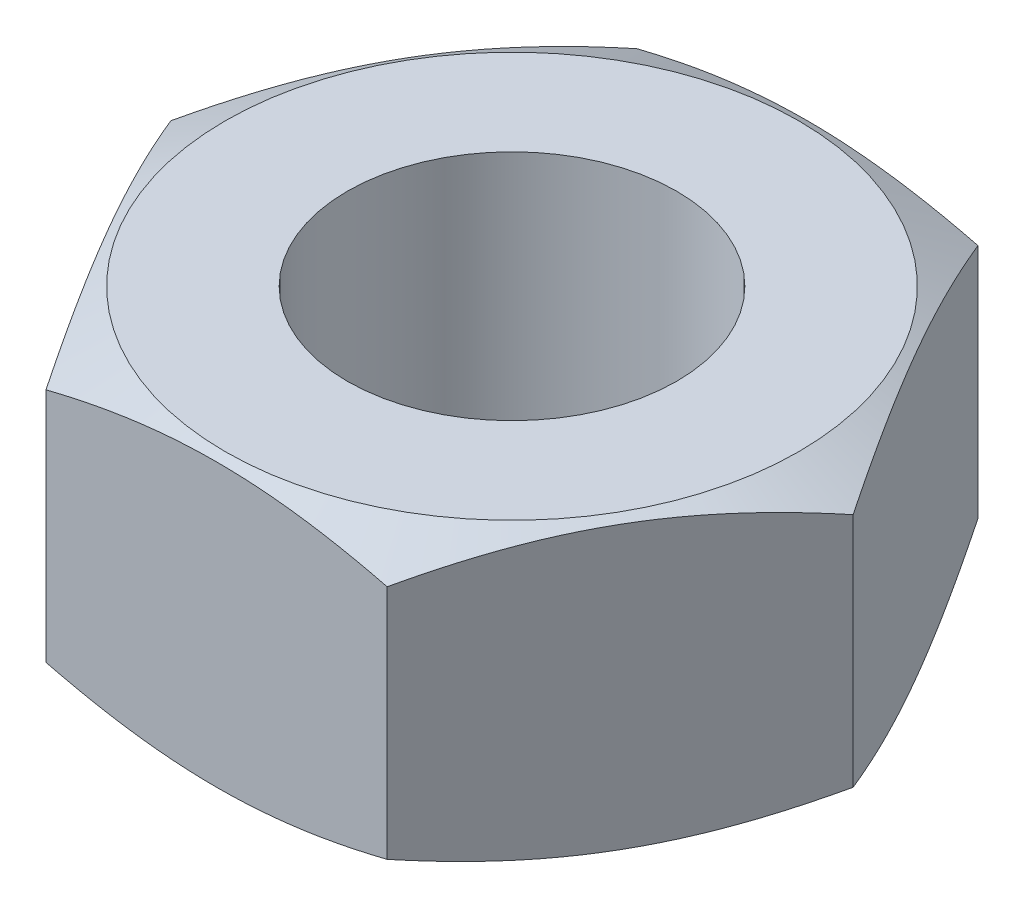
ISO-10303-21;
HEADER;
FILE_DESCRIPTION(('STEP AP214'),'2;1');
FILE_NAME('part.step','',(''),(''),'','','');
FILE_SCHEMA(('AUTOMOTIVE_DESIGN { 1 0 10303 214 1 1 1 1 }'));
ENDSEC;
DATA;
#1=APPLICATION_CONTEXT('core data for automotive mechanical design processes');
#2=APPLICATION_PROTOCOL_DEFINITION('international standard','automotive_design',2000,#1);
#3=PRODUCT_CONTEXT('',#1,'mechanical');
#4=PRODUCT('Part','Part','',(#3));
#5=PRODUCT_RELATED_PRODUCT_CATEGORY('part','',(#4));
#6=PRODUCT_DEFINITION_FORMATION('','',#4);
#7=PRODUCT_DEFINITION_CONTEXT('part definition',#1,'design');
#8=PRODUCT_DEFINITION('design','',#6,#7);
#9=PRODUCT_DEFINITION_SHAPE('','',#8);
#10=(LENGTH_UNIT() NAMED_UNIT(*) SI_UNIT(.MILLI.,.METRE.));
#11=(NAMED_UNIT(*) PLANE_ANGLE_UNIT() SI_UNIT($,.RADIAN.));
#12=(NAMED_UNIT(*) SI_UNIT($,.STERADIAN.) SOLID_ANGLE_UNIT());
#13=UNCERTAINTY_MEASURE_WITH_UNIT(LENGTH_MEASURE(1.E-05),#10,'distance_accuracy_value','');
#14=(GEOMETRIC_REPRESENTATION_CONTEXT(3) GLOBAL_UNCERTAINTY_ASSIGNED_CONTEXT((#13)) GLOBAL_UNIT_ASSIGNED_CONTEXT((#10,
#11,#12)) REPRESENTATION_CONTEXT('',''));
#15=CARTESIAN_POINT('',(0.,0.,0.));
#16=DIRECTION('',(0.,0.,1.));
#17=DIRECTION('',(1.,0.,0.));
#18=AXIS2_PLACEMENT_3D('',#15,#16,#17);
#19=CARTESIAN_POINT('',(-3.13091277478846,5.334,-5.42289999999993));
#20=DIRECTION('',(0.866025403784442,0.,0.499999999999995));
#21=DIRECTION('',(0.499999999999995,0.,-0.866025403784442));
#22=AXIS2_PLACEMENT_3D('',#19,#20,#21);
#23=PLANE('',#22);
#24=CARTESIAN_POINT('',(-6.26194101963064,0.500057736623868,0.000199999999999868));
#25=CARTESIAN_POINT('',(-6.17369545991849,0.455935781478425,-0.1526457929638));
#26=CARTESIAN_POINT('',(-6.08510610212949,0.414432168279962,-0.306087061664247));
#27=CARTESIAN_POINT('',(-5.90722176334585,0.337535609700191,-0.614191774308316));
#28=CARTESIAN_POINT('',(-5.81792644356177,0.302145811202055,-0.768855805052437));
#29=CARTESIAN_POINT('',(-5.63857013279826,0.238350806390194,-1.07951004795297));
#30=CARTESIAN_POINT('',(-5.54850820407262,0.20995601684515,-1.23550188433341));
#31=CARTESIAN_POINT('',(-5.36785876083838,0.161094132793057,-1.54839589837416));
#32=CARTESIAN_POINT('',(-5.27727133965656,0.140625671840454,-1.70529791438771));
#33=CARTESIAN_POINT('',(-5.09776644972782,0.108696792556972,-2.01620950395136));
#34=CARTESIAN_POINT('',(-5.00885768349816,0.0970426651718972,-2.17020400429938));
#35=CARTESIAN_POINT('',(-4.83085505949919,0.0824212042287932,-2.47851359294618));
#36=CARTESIAN_POINT('',(-4.74176119281807,0.0794542991000686,-2.63282869668065));
#37=CARTESIAN_POINT('',(-4.56370549877128,0.0823223435495307,-2.94123020534665));
#38=CARTESIAN_POINT('',(-4.47474363257952,0.0881478114386711,-3.09531667752692));
#39=CARTESIAN_POINT('',(-4.29707343491424,0.108358583586477,-3.40305048687399));
#40=CARTESIAN_POINT('',(-4.20836508247415,0.122743158102818,-3.55669786035595));
#41=CARTESIAN_POINT('',(-4.03693682315173,0.15839311141173,-3.85362031535548));
#42=CARTESIAN_POINT('',(-3.95419109610946,0.179168967230635,-3.99694011870193));
#43=CARTESIAN_POINT('',(-3.78916448003752,0.227189306779829,-4.2827746023397));
#44=CARTESIAN_POINT('',(-3.7068836415794,0.254434480895301,-4.42528919503852));
#45=CARTESIAN_POINT('',(-3.54194485685145,0.315051395555011,-4.710971550326));
#46=CARTESIAN_POINT('',(-3.45929293734415,0.348488068285119,-4.85412887425574));
#47=CARTESIAN_POINT('',(-3.29459559978141,0.42055469456989,-5.13939303078573));
#48=CARTESIAN_POINT('',(-3.21254991692544,0.459182219618196,-5.28150032203396));
#49=CARTESIAN_POINT('',(-3.13079730473462,0.500057736623867,-5.42309999999993));
#50=B_SPLINE_CURVE_WITH_KNOTS('',3,(#24,#25,#26,#27,#28,#29,#30,#31,#32,#33,#34,#35,#36,#37,#38,
#39,#40,#41,#42,#43,#44,#45,#46,#47,#48,#49),.UNSPECIFIED.,.F.,.F.,(4,2,2,2,2,2,2,2,2,2,2,2,4),
(0.,0.545795933830781,1.09187196636203,1.63875634966951,2.1855464117846,2.71993965626625,
3.25435925507189,3.7882029477844,4.32200113194735,4.82223513596726,5.32252254738889,
5.8283889029929,6.33401941095673),.UNSPECIFIED.);
#51=CARTESIAN_POINT('',(-6.2618255495768,0.5,0.));
#52=VERTEX_POINT('',#51);
#53=CARTESIAN_POINT('',(-3.13091277478846,0.499999999999999,-5.42289999999993));
#54=VERTEX_POINT('',#53);
#55=EDGE_CURVE('E62',#52,#54,#50,.T.);
#56=ORIENTED_EDGE('',*,*,#55,.F.);
#57=DIRECTION('',(0.,-1.,0.));
#58=VECTOR('',#57,1.);
#59=CARTESIAN_POINT('',(-6.2618255495768,5.334,0.));
#60=LINE('',#59,#58);
#61=CARTESIAN_POINT('',(-6.2618255495768,4.834,0.));
#62=VERTEX_POINT('',#61);
#63=EDGE_CURVE('E55',#62,#52,#60,.T.);
#64=ORIENTED_EDGE('',*,*,#63,.F.);
#65=CARTESIAN_POINT('',(-3.13079730473463,4.83394226337613,-5.42309999999993));
#66=CARTESIAN_POINT('',(-3.21904286444678,4.87806421852158,-5.27025420703613));
#67=CARTESIAN_POINT('',(-3.30763222223578,4.91956783172004,-5.11681293833568));
#68=CARTESIAN_POINT('',(-3.48551656101942,4.99646439029981,-4.80870822569161));
#69=CARTESIAN_POINT('',(-3.57481188080349,5.03185418879795,-4.65404419494749));
#70=CARTESIAN_POINT('',(-3.75416819156701,5.09564919360981,-4.34338995204695));
#71=CARTESIAN_POINT('',(-3.84423012029264,5.12404398315485,-4.18739811566651));
#72=CARTESIAN_POINT('',(-4.02487956352689,5.17290586720694,-3.87450410162576));
#73=CARTESIAN_POINT('',(-4.1154669847087,5.19337432815955,-3.71760208561222));
#74=CARTESIAN_POINT('',(-4.29497187463745,5.22530320744303,-3.40669049604856));
#75=CARTESIAN_POINT('',(-4.3838806408671,5.2369573348281,-3.25269599570054));
#76=CARTESIAN_POINT('',(-4.56188326486607,5.25157879577121,-2.94438640705374));
#77=CARTESIAN_POINT('',(-4.65097713154719,5.25454570089993,-2.79007130331927));
#78=CARTESIAN_POINT('',(-4.82903282559399,5.25167765645047,-2.48166979465327));
#79=CARTESIAN_POINT('',(-4.91799469178575,5.24585218856133,-2.327583322473));
#80=CARTESIAN_POINT('',(-5.09566488945103,5.22564141641352,-2.01984951312593));
#81=CARTESIAN_POINT('',(-5.18437324189112,5.21125684189718,-1.86620213964397));
#82=CARTESIAN_POINT('',(-5.35580150121353,5.17560688858827,-1.56927968464444));
#83=CARTESIAN_POINT('',(-5.43854722825581,5.15483103276936,-1.42595988129799));
#84=CARTESIAN_POINT('',(-5.60357384432775,5.10681069322017,-1.14012539766023));
#85=CARTESIAN_POINT('',(-5.68585468278586,5.0795655191047,-0.997610804961404));
#86=CARTESIAN_POINT('',(-5.85079346751381,5.01894860444499,-0.711928449673927));
#87=CARTESIAN_POINT('',(-5.93344538702112,4.98551193171488,-0.568771125744179));
#88=CARTESIAN_POINT('',(-6.09814272458385,4.91344530543011,-0.283506969214198));
#89=CARTESIAN_POINT('',(-6.18018840743983,4.8748177803818,-0.141399677965965));
#90=CARTESIAN_POINT('',(-6.26194101963064,4.83394226337613,0.000199999999999689));
#91=B_SPLINE_CURVE_WITH_KNOTS('',3,(#65,#66,#67,#68,#69,#70,#71,#72,#73,#74,#75,#76,#77,#78,#79,
#80,#81,#82,#83,#84,#85,#86,#87,#88,#89,#90),.UNSPECIFIED.,.F.,.F.,(4,2,2,2,2,2,2,2,2,2,2,2,4),
(0.,0.545795933830782,1.09187196636203,1.63875634966952,2.18554641178461,2.71993965626625,
3.25435925507189,3.7882029477844,4.32200113194735,4.82223513596727,5.32252254738889,
5.8283889029929,6.33401941095673),.UNSPECIFIED.);
#92=CARTESIAN_POINT('',(-3.13091277478847,4.834,-5.42289999999993));
#93=VERTEX_POINT('',#92);
#94=EDGE_CURVE('E140',#93,#62,#91,.T.);
#95=ORIENTED_EDGE('',*,*,#94,.F.);
#96=DIRECTION('',(0.,-1.,0.));
#97=VECTOR('',#96,1.);
#98=CARTESIAN_POINT('',(-3.13091277478846,5.334,-5.42289999999993));
#99=LINE('',#98,#97);
#100=EDGE_CURVE('E117',#93,#54,#99,.T.);
#101=ORIENTED_EDGE('',*,*,#100,.T.);
#102=EDGE_LOOP('',(#56,#64,#95,#101));
#103=FACE_BOUND('',#102,.T.);
#104=ADVANCED_FACE('F41',(#103),#23,.F.);
#105=CARTESIAN_POINT('',(-6.2618255495768,5.334,0.));
#106=DIRECTION('',(0.866025403784438,0.,-0.500000000000001));
#107=DIRECTION('',(-0.500000000000001,0.,-0.866025403784438));
#108=AXIS2_PLACEMENT_3D('',#105,#106,#107);
#109=PLANE('',#108);
#110=CARTESIAN_POINT('',(-3.13079730473455,0.500057736623867,5.42309999999997));
#111=CARTESIAN_POINT('',(-3.2190428644467,0.455935781478425,5.27025420703617));
#112=CARTESIAN_POINT('',(-3.3076322222357,0.414432168279961,5.11681293833572));
#113=CARTESIAN_POINT('',(-3.48551656101935,0.337535609700189,4.80870822569165));
#114=CARTESIAN_POINT('',(-3.57481188080342,0.302145811202052,4.65404419494753));
#115=CARTESIAN_POINT('',(-3.75416819156694,0.238350806390189,4.343389952047));
#116=CARTESIAN_POINT('',(-3.84423012029257,0.209956016845144,4.18739811566656));
#117=CARTESIAN_POINT('',(-4.02487956352682,0.16109413279305,3.87450410162581));
#118=CARTESIAN_POINT('',(-4.11546698470864,0.140625671840446,3.71760208561227));
#119=CARTESIAN_POINT('',(-4.29497187463739,0.108696792556964,3.40669049604861));
#120=CARTESIAN_POINT('',(-4.38388064086704,0.0970426651718886,3.25269599570059));
#121=CARTESIAN_POINT('',(-4.56188326486601,0.0824212042287834,2.94438640705379));
#122=CARTESIAN_POINT('',(-4.65097713154714,0.0794542991000579,2.79007130331932));
#123=CARTESIAN_POINT('',(-4.82903282559394,0.082322343549519,2.48166979465333));
#124=CARTESIAN_POINT('',(-4.9179946917857,0.0881478114386592,2.32758332247305));
#125=CARTESIAN_POINT('',(-5.09566488945098,0.108358583586464,2.01984951312598));
#126=CARTESIAN_POINT('',(-5.18437324189107,0.122743158102805,1.86620213964402));
#127=CARTESIAN_POINT('',(-5.35580150121349,0.158393111411717,1.56927968464449));
#128=CARTESIAN_POINT('',(-5.43854722825577,0.179168967230623,1.42595988129804));
#129=CARTESIAN_POINT('',(-5.60357384432772,0.227189306779818,1.14012539766026));
#130=CARTESIAN_POINT('',(-5.68585468278583,0.254434480895291,0.997610804961436));
#131=CARTESIAN_POINT('',(-5.85079346751379,0.315051395555004,0.71192844967395));
#132=CARTESIAN_POINT('',(-5.9334453870211,0.348488068285113,0.568771125744198));
#133=CARTESIAN_POINT('',(-6.09814272458384,0.420554694569888,0.283506969214207));
#134=CARTESIAN_POINT('',(-6.18018840743982,0.459182219618195,0.141399677965969));
#135=CARTESIAN_POINT('',(-6.26194101963064,0.500057736623868,-0.000200000000000303));
#136=B_SPLINE_CURVE_WITH_KNOTS('',3,(#110,#111,#112,#113,#114,#115,#116,#117,#118,#119,#120,
#121,#122,#123,#124,#125,#126,#127,#128,#129,#130,#131,#132,#133,#134,#135),.UNSPECIFIED.,.F.,
.F.,(4,2,2,2,2,2,2,2,2,2,2,2,4),(0.,0.545795933830782,1.09187196636203,1.63875634966952,
2.18554641178461,2.71993965626626,3.2543592550719,3.78820294778441,4.32200113194736,
4.82223513596729,5.32252254738893,5.82838890299296,6.33401941095681),.UNSPECIFIED.);
#137=CARTESIAN_POINT('',(-3.13091277478839,0.5,5.42289999999997));
#138=VERTEX_POINT('',#137);
#139=EDGE_CURVE('E136',#138,#52,#136,.T.);
#140=ORIENTED_EDGE('',*,*,#139,.F.);
#141=DIRECTION('',(0.,-1.,0.));
#142=VECTOR('',#141,1.);
#143=CARTESIAN_POINT('',(-3.13091277478839,5.334,5.42289999999997));
#144=LINE('',#143,#142);
#145=CARTESIAN_POINT('',(-3.13091277478839,4.834,5.42289999999997));
#146=VERTEX_POINT('',#145);
#147=EDGE_CURVE('E127',#146,#138,#144,.T.);
#148=ORIENTED_EDGE('',*,*,#147,.F.);
#149=CARTESIAN_POINT('',(-6.26194101963064,4.83394226337613,-0.000200000000000064));
#150=CARTESIAN_POINT('',(-6.17369545991849,4.87806421852157,0.152645792963799));
#151=CARTESIAN_POINT('',(-6.08510610212949,4.91956783172004,0.306087061664246));
#152=CARTESIAN_POINT('',(-5.90722176334584,4.99646439029981,0.614191774308316));
#153=CARTESIAN_POINT('',(-5.81792644356177,5.03185418879795,0.768855805052436));
#154=CARTESIAN_POINT('',(-5.63857013279825,5.09564919360981,1.07951004795297));
#155=CARTESIAN_POINT('',(-5.54850820407261,5.12404398315486,1.23550188433341));
#156=CARTESIAN_POINT('',(-5.36785876083837,5.17290586720695,1.54839589837416));
#157=CARTESIAN_POINT('',(-5.27727133965655,5.19337432815955,1.70529791438771));
#158=CARTESIAN_POINT('',(-5.0977664497278,5.22530320744304,2.01620950395136));
#159=CARTESIAN_POINT('',(-5.00885768349814,5.23695733482811,2.17020400429938));
#160=CARTESIAN_POINT('',(-4.83085505949917,5.25157879577122,2.47851359294618));
#161=CARTESIAN_POINT('',(-4.74176119281805,5.25454570089994,2.63282869668065));
#162=CARTESIAN_POINT('',(-4.56370549877125,5.25167765645048,2.94123020534665));
#163=CARTESIAN_POINT('',(-4.47474363257949,5.24585218856134,3.09531667752692));
#164=CARTESIAN_POINT('',(-4.29707343491421,5.22564141641353,3.40305048687399));
#165=CARTESIAN_POINT('',(-4.20836508247412,5.21125684189719,3.55669786035595));
#166=CARTESIAN_POINT('',(-4.0369368231517,5.17560688858828,3.85362031535548));
#167=CARTESIAN_POINT('',(-3.95419109610942,5.15483103276938,3.99694011870194));
#168=CARTESIAN_POINT('',(-3.78916448003747,5.10681069322018,4.28277460233971));
#169=CARTESIAN_POINT('',(-3.70688364157935,5.07956551910471,4.42528919503854));
#170=CARTESIAN_POINT('',(-3.5419448568514,5.018948604445,4.71097155032602));
#171=CARTESIAN_POINT('',(-3.45929293734409,4.98551193171489,4.85412887425577));
#172=CARTESIAN_POINT('',(-3.29459559978135,4.91344530543011,5.13939303078576));
#173=CARTESIAN_POINT('',(-3.21254991692537,4.87481778038181,5.281500322034));
#174=CARTESIAN_POINT('',(-3.13079730473455,4.83394226337613,5.42309999999997));
#175=B_SPLINE_CURVE_WITH_KNOTS('',3,(#149,#150,#151,#152,#153,#154,#155,#156,#157,#158,#159,
#160,#161,#162,#163,#164,#165,#166,#167,#168,#169,#170,#171,#172,#173,#174),.UNSPECIFIED.,.F.,
.F.,(4,2,2,2,2,2,2,2,2,2,2,2,4),(0.,0.545795933830784,1.09187196636203,1.63875634966952,
2.18554641178461,2.71993965626626,3.2543592550719,3.78820294778441,4.32200113194737,
4.8222351359673,5.32252254738894,5.82838890299296,6.33401941095681),.UNSPECIFIED.);
#176=EDGE_CURVE('E137',#62,#146,#175,.T.);
#177=ORIENTED_EDGE('',*,*,#176,.F.);
#178=ORIENTED_EDGE('',*,*,#63,.T.);
#179=EDGE_LOOP('',(#140,#148,#177,#178));
#180=FACE_BOUND('',#179,.T.);
#181=ADVANCED_FACE('F134',(#180),#109,.F.);
#182=CARTESIAN_POINT('',(-3.13091277478839,5.334,5.42289999999997));
#183=DIRECTION('',(0.,0.,-1.));
#184=DIRECTION('',(-1.,0.,0.));
#185=AXIS2_PLACEMENT_3D('',#182,#183,#184);
#186=PLANE('',#185);
#187=CARTESIAN_POINT('',(9.41286883606086,2.80070632394461,5.42289999999993));
#188=CARTESIAN_POINT('',(9.1472750554483,2.68566893769273,5.42289999999993));
#189=CARTESIAN_POINT('',(8.88125376203867,2.57160320996092,5.42289999999993));
#190=CARTESIAN_POINT('',(8.3481121600018,2.34599199549152,5.42289999999993));
#191=CARTESIAN_POINT('',(8.080991736944,2.2344467794366,5.42289999999993));
#192=CARTESIAN_POINT('',(7.54461388053953,2.01412893406292,5.42289999999993));
#193=CARTESIAN_POINT('',(7.27535235403709,1.90536623918134,5.42289999999994));
#194=CARTESIAN_POINT('',(6.73525963015158,1.6918237577284,5.42289999999994));
#195=CARTESIAN_POINT('',(6.46442848344184,1.58704384339407,5.42289999999994));
#196=CARTESIAN_POINT('',(5.92100087596729,1.38262861865183,5.42289999999994));
#197=CARTESIAN_POINT('',(5.64840552599969,1.28299036975193,5.42289999999994));
#198=CARTESIAN_POINT('',(5.10087289685534,1.09027354065501,5.42289999999994));
#199=CARTESIAN_POINT('',(4.82593546272766,0.997195398308566,5.42289999999994));
#200=CARTESIAN_POINT('',(4.27349214036522,0.819661138244824,5.42289999999995));
#201=CARTESIAN_POINT('',(3.99598840175867,0.735198411517364,5.42289999999995));
#202=CARTESIAN_POINT('',(3.43786819339723,0.577426615326232,5.42289999999995));
#203=CARTESIAN_POINT('',(3.15725223623973,0.504115737531636,5.42289999999995));
#204=CARTESIAN_POINT('',(2.49924683605525,0.350036104214222,5.42289999999995));
#205=CARTESIAN_POINT('',(2.12049458394304,0.274795987052106,5.42289999999995));
#206=CARTESIAN_POINT('',(1.54863197932962,0.187470983991547,5.42289999999995));
#207=CARTESIAN_POINT('',(1.35744802483645,0.162622226657487,5.42289999999995));
#208=CARTESIAN_POINT('',(0.974074285825282,0.122338994580435,5.42289999999996));
#209=CARTESIAN_POINT('',(0.781884522104947,0.106904325946938,5.42289999999996));
#210=CARTESIAN_POINT('',(0.397220506987814,0.0861226939491348,5.42289999999996));
#211=CARTESIAN_POINT('',(0.204747013077038,0.0807618526709558,5.42289999999996));
#212=CARTESIAN_POINT('',(-0.1802106882086,0.0803264747935539,5.42289999999996));
#213=CARTESIAN_POINT('',(-0.37269489550567,0.0852518713159671,5.42289999999996));
#214=CARTESIAN_POINT('',(-0.757194921192102,0.105170476865174,5.42289999999996));
#215=CARTESIAN_POINT('',(-0.949210577761384,0.120166774242633,5.42289999999996));
#216=CARTESIAN_POINT('',(-1.33226091016992,0.15958889879216,5.42289999999996));
#217=CARTESIAN_POINT('',(-1.5232955462678,0.184015104965792,5.42289999999996));
#218=CARTESIAN_POINT('',(-2.04528010755779,0.26266270888676,5.42289999999997));
#219=CARTESIAN_POINT('',(-2.37493241332223,0.325546733998981,5.42289999999997));
#220=CARTESIAN_POINT('',(-3.02973781322695,0.471543411178683,5.42289999999997));
#221=CARTESIAN_POINT('',(-3.35488862287709,0.554665963214938,5.42289999999997));
#222=CARTESIAN_POINT('',(-4.00207646969348,0.736300109095431,5.42289999999997));
#223=CARTESIAN_POINT('',(-4.32409788194112,0.834866570952586,5.42289999999997));
#224=CARTESIAN_POINT('',(-4.96441657443514,1.04312367597351,5.42289999999998));
#225=CARTESIAN_POINT('',(-5.2827144812871,1.15281241650464,5.42289999999998));
#226=CARTESIAN_POINT('',(-5.92349779539415,1.38296660234567,5.42289999999998));
#227=CARTESIAN_POINT('',(-6.24591536794086,1.50361951855927,5.42289999999998));
#228=CARTESIAN_POINT('',(-6.88830733736464,1.75129115692624,5.42289999999998));
#229=CARTESIAN_POINT('',(-7.20828156336565,1.87831031969026,5.42289999999998));
#230=CARTESIAN_POINT('',(-7.84324210515071,2.13590502541901,5.42289999999999));
#231=CARTESIAN_POINT('',(-8.15824690091784,2.26643516996883,5.42289999999999));
#232=CARTESIAN_POINT('',(-8.62957463046562,2.46492544368639,5.42289999999999));
#233=CARTESIAN_POINT('',(-8.78647063469707,2.53153080098465,5.42289999999999));
#234=CARTESIAN_POINT('',(-9.09991798724229,2.66554267819196,5.42289999999999));
#235=CARTESIAN_POINT('',(-9.25646933967113,2.73294918847324,5.42289999999999));
#236=CARTESIAN_POINT('',(-9.41286883606082,2.80070632394461,5.42289999999999));
#237=B_SPLINE_CURVE_WITH_KNOTS('',3,(#187,#188,#189,#190,#191,#192,#193,#194,#195,#196,#197,
#198,#199,#200,#201,#202,#203,#204,#205,#206,#207,#208,#209,#210,#211,#212,#213,#214,#215,#216,
#217,#218,#219,#220,#221,#222,#223,#224,#225,#226,#227,#228,#229,#230,#231,#232,#233,#234,#235,
#236),.UNSPECIFIED.,.F.,.F.,(4,2,2,2,2,2,2,2,2,2,2,2,2,2,2,2,2,2,2,2,2,2,2,2,4),(0.,
0.868317569419298,1.73672795018452,2.60789728733251,3.47903865475466,4.34967651699623,
5.22037243454336,6.09039532447923,6.9602769848959,8.11735098202632,8.69553297306075,
9.27370305558358,9.85107605340148,10.4284452973064,11.0059916786345,11.5835612747973,
12.5894378462109,13.5958074487727,14.6058370537885,15.6156941686484,16.6483639896541,
17.6811053811423,18.7040099107795,19.2153531732435,19.7266902968971),.UNSPECIFIED.);
#238=CARTESIAN_POINT('',(3.13091277478842,0.5,5.42289999999995));
#239=VERTEX_POINT('',#238);
#240=EDGE_CURVE('E145',#239,#138,#237,.T.);
#241=ORIENTED_EDGE('',*,*,#240,.F.);
#242=DIRECTION('',(0.,-1.,0.));
#243=VECTOR('',#242,1.);
#244=CARTESIAN_POINT('',(3.13091277478842,5.334,5.42289999999995));
#245=LINE('',#244,#243);
#246=CARTESIAN_POINT('',(3.13091277478843,4.834,5.42289999999995));
#247=VERTEX_POINT('',#246);
#248=EDGE_CURVE('E119',#247,#239,#245,.T.);
#249=ORIENTED_EDGE('',*,*,#248,.F.);
#250=CARTESIAN_POINT('',(-9.41286883606082,2.53329367605539,5.42289999999999));
#251=CARTESIAN_POINT('',(-9.14727505544826,2.64833106230727,5.42289999999999));
#252=CARTESIAN_POINT('',(-8.88125376203863,2.76239679003908,5.42289999999999));
#253=CARTESIAN_POINT('',(-8.34811216000176,2.98800800450849,5.42289999999999));
#254=CARTESIAN_POINT('',(-8.08099173694395,3.0995532205634,5.42289999999999));
#255=CARTESIAN_POINT('',(-7.54461388053949,3.31987106593708,5.42289999999999));
#256=CARTESIAN_POINT('',(-7.27535235403705,3.42863376081867,5.42289999999998));
#257=CARTESIAN_POINT('',(-6.73525963015153,3.64217624227161,5.42289999999998));
#258=CARTESIAN_POINT('',(-6.46442848344179,3.74695615660593,5.42289999999998));
#259=CARTESIAN_POINT('',(-5.92100087596725,3.95137138134817,5.42289999999998));
#260=CARTESIAN_POINT('',(-5.64840552599965,4.05100963024807,5.42289999999998));
#261=CARTESIAN_POINT('',(-5.1008728968553,4.24372645934499,5.42289999999998));
#262=CARTESIAN_POINT('',(-4.82593546272762,4.33680460169144,5.42289999999998));
#263=CARTESIAN_POINT('',(-4.27349214036518,4.51433886175518,5.42289999999997));
#264=CARTESIAN_POINT('',(-3.99598840175862,4.59880158848264,5.42289999999997));
#265=CARTESIAN_POINT('',(-3.43786819339718,4.75657338467377,5.42289999999997));
#266=CARTESIAN_POINT('',(-3.15725223623968,4.82988426246837,5.42289999999997));
#267=CARTESIAN_POINT('',(-2.4992468360552,4.98396389578578,5.42289999999997));
#268=CARTESIAN_POINT('',(-2.12049458394299,5.0592040129479,5.42289999999997));
#269=CARTESIAN_POINT('',(-1.54863197932957,5.14652901600845,5.42289999999996));
#270=CARTESIAN_POINT('',(-1.3574480248364,5.17137777334251,5.42289999999996));
#271=CARTESIAN_POINT('',(-0.974074285825233,5.21166100541957,5.42289999999996));
#272=CARTESIAN_POINT('',(-0.781884522104897,5.22709567405306,5.42289999999996));
#273=CARTESIAN_POINT('',(-0.397220506987764,5.24787730605086,5.42289999999996));
#274=CARTESIAN_POINT('',(-0.204747013076988,5.25323814732904,5.42289999999996));
#275=CARTESIAN_POINT('',(0.180210688208651,5.25367352520645,5.42289999999996));
#276=CARTESIAN_POINT('',(0.37269489550572,5.24874812868403,5.42289999999996));
#277=CARTESIAN_POINT('',(0.757194921192152,5.22882952313483,5.42289999999996));
#278=CARTESIAN_POINT('',(0.949210577761436,5.21383322575736,5.42289999999996));
#279=CARTESIAN_POINT('',(1.33226091016997,5.17441110120784,5.42289999999995));
#280=CARTESIAN_POINT('',(1.52329554626786,5.14998489503421,5.42289999999995));
#281=CARTESIAN_POINT('',(2.04528010755785,5.07133729111324,5.42289999999995));
#282=CARTESIAN_POINT('',(2.37493241332228,5.00845326600102,5.42289999999995));
#283=CARTESIAN_POINT('',(3.029737813227,4.86245658882131,5.42289999999995));
#284=CARTESIAN_POINT('',(3.35488862287714,4.77933403678506,5.42289999999995));
#285=CARTESIAN_POINT('',(4.00207646969353,4.59769989090456,5.42289999999995));
#286=CARTESIAN_POINT('',(4.32409788194117,4.49913342904741,5.42289999999995));
#287=CARTESIAN_POINT('',(4.96441657443519,4.29087632402649,5.42289999999994));
#288=CARTESIAN_POINT('',(5.28271448128715,4.18118758349535,5.42289999999994));
#289=CARTESIAN_POINT('',(5.92349779539419,3.95103339765432,5.42289999999994));
#290=CARTESIAN_POINT('',(6.24591536794091,3.83038048144072,5.42289999999994));
#291=CARTESIAN_POINT('',(6.88830733736469,3.58270884307376,5.42289999999994));
#292=CARTESIAN_POINT('',(7.2082815633657,3.45568968030974,5.42289999999994));
#293=CARTESIAN_POINT('',(7.84324210515076,3.19809497458099,5.42289999999993));
#294=CARTESIAN_POINT('',(8.15824690091789,3.06756483003116,5.42289999999993));
#295=CARTESIAN_POINT('',(8.62957463046567,2.86907455631361,5.42289999999993));
#296=CARTESIAN_POINT('',(8.78647063469711,2.80246919901535,5.42289999999993));
#297=CARTESIAN_POINT('',(9.09991798724232,2.66845732180804,5.42289999999993));
#298=CARTESIAN_POINT('',(9.25646933967117,2.60105081152676,5.42289999999993));
#299=CARTESIAN_POINT('',(9.41286883606086,2.53329367605539,5.42289999999993));
#300=B_SPLINE_CURVE_WITH_KNOTS('',3,(#250,#251,#252,#253,#254,#255,#256,#257,#258,#259,#260,
#261,#262,#263,#264,#265,#266,#267,#268,#269,#270,#271,#272,#273,#274,#275,#276,#277,#278,#279,
#280,#281,#282,#283,#284,#285,#286,#287,#288,#289,#290,#291,#292,#293,#294,#295,#296,#297,#298,
#299),.UNSPECIFIED.,.F.,.F.,(4,2,2,2,2,2,2,2,2,2,2,2,2,2,2,2,2,2,2,2,2,2,2,2,4),(0.,
0.868317569419301,1.73672795018452,2.60789728733252,3.47903865475467,4.34967651699624,
5.22037243454336,6.09039532447923,6.96027698489591,8.11735098202633,8.69553297306076,
9.27370305558359,9.85107605340149,10.4284452973064,11.0059916786346,11.5835612747974,
12.5894378462109,13.5958074487727,14.6058370537885,15.6156941686484,16.6483639896541,
17.6811053811424,18.7040099107795,19.2153531732435,19.7266902968971),.UNSPECIFIED.);
#301=EDGE_CURVE('E199',#146,#247,#300,.T.);
#302=ORIENTED_EDGE('',*,*,#301,.F.);
#303=ORIENTED_EDGE('',*,*,#147,.T.);
#304=EDGE_LOOP('',(#241,#249,#302,#303));
#305=FACE_BOUND('',#304,.T.);
#306=ADVANCED_FACE('F190',(#305),#186,.F.);
#307=CARTESIAN_POINT('',(3.13091277478842,5.334,5.42289999999995));
#308=DIRECTION('',(-0.866025403784442,0.,-0.499999999999995));
#309=DIRECTION('',(-0.499999999999995,0.,0.866025403784441));
#310=AXIS2_PLACEMENT_3D('',#307,#308,#309);
#311=PLANE('',#310);
#312=CARTESIAN_POINT('',(6.26194101963064,0.500057736623867,-0.000200000000043726));
#313=CARTESIAN_POINT('',(6.17369545991849,0.455935781478424,0.152645792963756));
#314=CARTESIAN_POINT('',(6.08510610212949,0.414432168279961,0.306087061664203));
#315=CARTESIAN_POINT('',(5.90722176334584,0.337535609700188,0.614191774308274));
#316=CARTESIAN_POINT('',(5.81792644356177,0.302145811202052,0.768855805052395));
#317=CARTESIAN_POINT('',(5.63857013279825,0.238350806390189,1.07951004795293));
#318=CARTESIAN_POINT('',(5.54850820407262,0.209956016845144,1.23550188433337));
#319=CARTESIAN_POINT('',(5.36785876083838,0.16109413279305,1.54839589837412));
#320=CARTESIAN_POINT('',(5.27727133965656,0.140625671840446,1.70529791438767));
#321=CARTESIAN_POINT('',(5.09776644972781,0.108696792556964,2.01620950395132));
#322=CARTESIAN_POINT('',(5.00885768349816,0.0970426651718881,2.17020400429934));
#323=CARTESIAN_POINT('',(4.83085505949919,0.082421204228783,2.47851359294614));
#324=CARTESIAN_POINT('',(4.74176119281807,0.0794542991000579,2.63282869668062));
#325=CARTESIAN_POINT('',(4.56370549877127,0.0823223435495189,2.94123020534661));
#326=CARTESIAN_POINT('',(4.47474363257951,0.0881478114386586,3.09531667752689));
#327=CARTESIAN_POINT('',(4.29707343491424,0.108358583586464,3.40305048687396));
#328=CARTESIAN_POINT('',(4.20836508247415,0.122743158102805,3.55669786035592));
#329=CARTESIAN_POINT('',(4.03693682315173,0.158393111411717,3.85362031535545));
#330=CARTESIAN_POINT('',(3.95419109610945,0.179168967230622,3.9969401187019));
#331=CARTESIAN_POINT('',(3.7891644800375,0.227189306779817,4.28277460233968));
#332=CARTESIAN_POINT('',(3.70688364157939,0.25443448089529,4.42528919503851));
#333=CARTESIAN_POINT('',(3.54194485685143,0.315051395555003,4.71097155032599));
#334=CARTESIAN_POINT('',(3.45929293734412,0.348488068285113,4.85412887425575));
#335=CARTESIAN_POINT('',(3.29459559978138,0.420554694569887,5.13939303078574));
#336=CARTESIAN_POINT('',(3.2125499169254,0.459182219618195,5.28150032203398));
#337=CARTESIAN_POINT('',(3.13079730473459,0.500057736623868,5.42309999999995));
#338=B_SPLINE_CURVE_WITH_KNOTS('',3,(#312,#313,#314,#315,#316,#317,#318,#319,#320,#321,#322,
#323,#324,#325,#326,#327,#328,#329,#330,#331,#332,#333,#334,#335,#336,#337),.UNSPECIFIED.,.F.,
.F.,(4,2,2,2,2,2,2,2,2,2,2,2,4),(0.,0.545795933830783,1.09187196636203,1.63875634966952,
2.18554641178461,2.71993965626626,3.2543592550719,3.78820294778441,4.32200113194736,
4.82223513596729,5.32252254738893,5.82838890299296,6.33401941095681),.UNSPECIFIED.);
#339=CARTESIAN_POINT('',(6.2618255495768,0.5,0.));
#340=VERTEX_POINT('',#339);
#341=EDGE_CURVE('E114',#340,#239,#338,.T.);
#342=ORIENTED_EDGE('',*,*,#341,.F.);
#343=DIRECTION('',(0.,-1.,0.));
#344=VECTOR('',#343,1.);
#345=CARTESIAN_POINT('',(6.2618255495768,5.334,0.));
#346=LINE('',#345,#344);
#347=CARTESIAN_POINT('',(6.2618255495768,4.834,0.));
#348=VERTEX_POINT('',#347);
#349=EDGE_CURVE('E113',#348,#340,#346,.T.);
#350=ORIENTED_EDGE('',*,*,#349,.F.);
#351=CARTESIAN_POINT('',(3.13079730473459,4.83394226337613,5.42309999999995));
#352=CARTESIAN_POINT('',(3.21904286444674,4.87806421852158,5.27025420703615));
#353=CARTESIAN_POINT('',(3.30763222223574,4.91956783172004,5.1168129383357));
#354=CARTESIAN_POINT('',(3.48551656101938,4.99646439029981,4.80870822569163));
#355=CARTESIAN_POINT('',(3.57481188080345,5.03185418879795,4.65404419494751));
#356=CARTESIAN_POINT('',(3.75416819156697,5.09564919360981,4.34338995204698));
#357=CARTESIAN_POINT('',(3.8442301202926,5.12404398315486,4.18739811566653));
#358=CARTESIAN_POINT('',(4.02487956352685,5.17290586720695,3.87450410162579));
#359=CARTESIAN_POINT('',(4.11546698470867,5.19337432815955,3.71760208561224));
#360=CARTESIAN_POINT('',(4.29497187463741,5.22530320744304,3.40669049604858));
#361=CARTESIAN_POINT('',(4.38388064086706,5.23695733482811,3.25269599570056));
#362=CARTESIAN_POINT('',(4.56188326486603,5.25157879577122,2.94438640705376));
#363=CARTESIAN_POINT('',(4.65097713154716,5.25454570089994,2.79007130331929));
#364=CARTESIAN_POINT('',(4.82903282559395,5.25167765645048,2.48166979465329));
#365=CARTESIAN_POINT('',(4.91799469178571,5.24585218856134,2.32758332247302));
#366=CARTESIAN_POINT('',(5.09566488945099,5.22564141641354,2.01984951312595));
#367=CARTESIAN_POINT('',(5.18437324189108,5.21125684189719,1.86620213964398));
#368=CARTESIAN_POINT('',(5.3558015012135,5.17560688858828,1.56927968464445));
#369=CARTESIAN_POINT('',(5.43854722825578,5.15483103276938,1.425959881298));
#370=CARTESIAN_POINT('',(5.60357384432773,5.10681069322018,1.14012539766022));
#371=CARTESIAN_POINT('',(5.68585468278584,5.07956551910471,0.997610804961395));
#372=CARTESIAN_POINT('',(5.8507934675138,5.018948604445,0.711928449673908));
#373=CARTESIAN_POINT('',(5.9334453870211,4.98551193171489,0.568771125744155));
#374=CARTESIAN_POINT('',(6.09814272458384,4.91344530543011,0.283506969214164));
#375=CARTESIAN_POINT('',(6.18018840743982,4.87481778038181,0.141399677965926));
#376=CARTESIAN_POINT('',(6.26194101963064,4.83394226337613,-0.000200000000043792));
#377=B_SPLINE_CURVE_WITH_KNOTS('',3,(#351,#352,#353,#354,#355,#356,#357,#358,#359,#360,#361,
#362,#363,#364,#365,#366,#367,#368,#369,#370,#371,#372,#373,#374,#375,#376),.UNSPECIFIED.,.F.,
.F.,(4,2,2,2,2,2,2,2,2,2,2,2,4),(0.,0.545795933830782,1.09187196636203,1.63875634966952,
2.18554641178461,2.71993965626626,3.2543592550719,3.78820294778441,4.32200113194736,
4.8222351359673,5.32252254738894,5.82838890299296,6.33401941095681),.UNSPECIFIED.);
#378=EDGE_CURVE('E206',#247,#348,#377,.T.);
#379=ORIENTED_EDGE('',*,*,#378,.F.);
#380=ORIENTED_EDGE('',*,*,#248,.T.);
#381=EDGE_LOOP('',(#342,#350,#379,#380));
#382=FACE_BOUND('',#381,.T.);
#383=ADVANCED_FACE('F193',(#382),#311,.F.);
#384=CARTESIAN_POINT('',(6.2618255495768,5.334,0.));
#385=DIRECTION('',(-0.866025403784435,0.,0.500000000000007));
#386=DIRECTION('',(0.500000000000007,0.,0.866025403784435));
#387=AXIS2_PLACEMENT_3D('',#384,#385,#386);
#388=PLANE('',#387);
#389=CARTESIAN_POINT('',(3.13079730473451,0.500057736623867,-5.42309999999999));
#390=CARTESIAN_POINT('',(3.21904286444666,0.455935781478424,-5.27025420703619));
#391=CARTESIAN_POINT('',(3.30763222223567,0.41443216827996,-5.11681293833575));
#392=CARTESIAN_POINT('',(3.48551656101931,0.337535609700188,-4.80870822569168));
#393=CARTESIAN_POINT('',(3.57481188080339,0.302145811202051,-4.65404419494756));
#394=CARTESIAN_POINT('',(3.75416819156691,0.238350806390188,-4.34338995204703));
#395=CARTESIAN_POINT('',(3.84423012029254,0.209956016845144,-4.18739811566658));
#396=CARTESIAN_POINT('',(4.02487956352679,0.161094132793049,-3.87450410162584));
#397=CARTESIAN_POINT('',(4.11546698470861,0.140625671840446,-3.71760208561229));
#398=CARTESIAN_POINT('',(4.29497187463736,0.108696792556963,-3.40669049604864));
#399=CARTESIAN_POINT('',(4.38388064086702,0.0970426651718876,-3.25269599570062));
#400=CARTESIAN_POINT('',(4.56188326486599,0.0824212042287828,-2.94438640705382));
#401=CARTESIAN_POINT('',(4.65097713154712,0.0794542991000577,-2.79007130331935));
#402=CARTESIAN_POINT('',(4.82903282559392,0.0823223435495188,-2.48166979465336));
#403=CARTESIAN_POINT('',(4.91799469178568,0.0881478114386584,-2.32758332247309));
#404=CARTESIAN_POINT('',(5.09566488945096,0.108358583586464,-2.01984951312602));
#405=CARTESIAN_POINT('',(5.18437324189105,0.122743158102804,-1.86620213964406));
#406=CARTESIAN_POINT('',(5.35580150121348,0.158393111411716,-1.56927968464453));
#407=CARTESIAN_POINT('',(5.43854722825576,0.179168967230622,-1.42595988129808));
#408=CARTESIAN_POINT('',(5.60357384432771,0.227189306779817,-1.1401253976603));
#409=CARTESIAN_POINT('',(5.68585468278583,0.254434480895291,-0.997610804961475));
#410=CARTESIAN_POINT('',(5.85079346751379,0.315051395555004,-0.71192844967399));
#411=CARTESIAN_POINT('',(5.9334453870211,0.348488068285113,-0.568771125744238));
#412=CARTESIAN_POINT('',(6.09814272458384,0.420554694569887,-0.283506969214249));
#413=CARTESIAN_POINT('',(6.18018840743982,0.459182219618194,-0.141399677966012));
#414=CARTESIAN_POINT('',(6.26194101963064,0.500057736623867,0.00019999999995657));
#415=B_SPLINE_CURVE_WITH_KNOTS('',3,(#389,#390,#391,#392,#393,#394,#395,#396,#397,#398,#399,
#400,#401,#402,#403,#404,#405,#406,#407,#408,#409,#410,#411,#412,#413,#414),.UNSPECIFIED.,.F.,
.F.,(4,2,2,2,2,2,2,2,2,2,2,2,4),(0.,0.545795933830783,1.09187196636203,1.63875634966952,
2.18554641178461,2.71993965626626,3.2543592550719,3.78820294778441,4.32200113194736,
4.82223513596729,5.32252254738893,5.82838890299296,6.33401941095681),.UNSPECIFIED.);
#416=CARTESIAN_POINT('',(3.13091277478835,0.5,-5.42289999999999));
#417=VERTEX_POINT('',#416);
#418=EDGE_CURVE('E99',#417,#340,#415,.T.);
#419=ORIENTED_EDGE('',*,*,#418,.F.);
#420=DIRECTION('',(0.,-1.,0.));
#421=VECTOR('',#420,1.);
#422=CARTESIAN_POINT('',(3.13091277478835,5.334,-5.42289999999999));
#423=LINE('',#422,#421);
#424=CARTESIAN_POINT('',(3.13091277478835,4.834,-5.42289999999999));
#425=VERTEX_POINT('',#424);
#426=EDGE_CURVE('E111',#425,#417,#423,.T.);
#427=ORIENTED_EDGE('',*,*,#426,.F.);
#428=CARTESIAN_POINT('',(6.26194101963064,4.83394226337613,0.000199999999956274));
#429=CARTESIAN_POINT('',(6.17369545991848,4.87806421852158,-0.152645792963842));
#430=CARTESIAN_POINT('',(6.08510610212948,4.91956783172004,-0.306087061664289));
#431=CARTESIAN_POINT('',(5.90722176334583,4.99646439029981,-0.614191774308357));
#432=CARTESIAN_POINT('',(5.81792644356176,5.03185418879795,-0.768855805052477));
#433=CARTESIAN_POINT('',(5.63857013279824,5.09564919360981,-1.07951004795301));
#434=CARTESIAN_POINT('',(5.5485082040726,5.12404398315486,-1.23550188433345));
#435=CARTESIAN_POINT('',(5.36785876083835,5.17290586720695,-1.5483958983742));
#436=CARTESIAN_POINT('',(5.27727133965654,5.19337432815955,-1.70529791438774));
#437=CARTESIAN_POINT('',(5.09776644972778,5.22530320744304,-2.0162095039514));
#438=CARTESIAN_POINT('',(5.00885768349813,5.23695733482811,-2.17020400429942));
#439=CARTESIAN_POINT('',(4.83085505949915,5.25157879577122,-2.47851359294622));
#440=CARTESIAN_POINT('',(4.74176119281803,5.25454570089994,-2.63282869668069));
#441=CARTESIAN_POINT('',(4.56370549877123,5.25167765645048,-2.94123020534668));
#442=CARTESIAN_POINT('',(4.47474363257947,5.24585218856134,-3.09531667752695));
#443=CARTESIAN_POINT('',(4.29707343491419,5.22564141641354,-3.40305048687402));
#444=CARTESIAN_POINT('',(4.20836508247409,5.21125684189719,-3.55669786035598));
#445=CARTESIAN_POINT('',(4.03693682315167,5.17560688858828,-3.85362031535551));
#446=CARTESIAN_POINT('',(3.95419109610939,5.15483103276938,-3.99694011870196));
#447=CARTESIAN_POINT('',(3.78916448003744,5.10681069322018,-4.28277460233974));
#448=CARTESIAN_POINT('',(3.70688364157932,5.07956551910471,-4.42528919503856));
#449=CARTESIAN_POINT('',(3.54194485685136,5.018948604445,-4.71097155032605));
#450=CARTESIAN_POINT('',(3.45929293734405,4.98551193171489,-4.8541288742558));
#451=CARTESIAN_POINT('',(3.29459559978131,4.91344530543011,-5.13939303078579));
#452=CARTESIAN_POINT('',(3.21254991692533,4.87481778038181,-5.28150032203402));
#453=CARTESIAN_POINT('',(3.13079730473451,4.83394226337613,-5.42309999999999));
#454=B_SPLINE_CURVE_WITH_KNOTS('',3,(#428,#429,#430,#431,#432,#433,#434,#435,#436,#437,#438,
#439,#440,#441,#442,#443,#444,#445,#446,#447,#448,#449,#450,#451,#452,#453),.UNSPECIFIED.,.F.,
.F.,(4,2,2,2,2,2,2,2,2,2,2,2,4),(0.,0.545795933830783,1.09187196636203,1.63875634966952,
2.18554641178461,2.71993965626626,3.2543592550719,3.78820294778441,4.32200113194737,
4.8222351359673,5.32252254738894,5.82838890299296,6.33401941095681),.UNSPECIFIED.);
#455=EDGE_CURVE('E69',#348,#425,#454,.T.);
#456=ORIENTED_EDGE('',*,*,#455,.F.);
#457=ORIENTED_EDGE('',*,*,#349,.T.);
#458=EDGE_LOOP('',(#419,#427,#456,#457));
#459=FACE_BOUND('',#458,.T.);
#460=ADVANCED_FACE('F110',(#459),#388,.F.);
#461=CARTESIAN_POINT('',(3.13091277478835,5.334,-5.42289999999999));
#462=DIRECTION('',(0.,0.,1.));
#463=DIRECTION('',(1.,0.,0.));
#464=AXIS2_PLACEMENT_3D('',#461,#462,#463);
#465=PLANE('',#464);
#466=CARTESIAN_POINT('',(-9.4128688360609,2.80070632394461,-5.42289999999986));
#467=CARTESIAN_POINT('',(-9.14727505544833,2.68566893769273,-5.42289999999986));
#468=CARTESIAN_POINT('',(-8.8812537620387,2.57160320996092,-5.42289999999987));
#469=CARTESIAN_POINT('',(-8.34811216000184,2.34599199549152,-5.42289999999987));
#470=CARTESIAN_POINT('',(-8.08099173694403,2.2344467794366,-5.42289999999987));
#471=CARTESIAN_POINT('',(-7.54461388053957,2.01412893406292,-5.42289999999988));
#472=CARTESIAN_POINT('',(-7.27535235403713,1.90536623918133,-5.42289999999988));
#473=CARTESIAN_POINT('',(-6.73525963015161,1.69182375772839,-5.42289999999989));
#474=CARTESIAN_POINT('',(-6.46442848344187,1.58704384339407,-5.42289999999989));
#475=CARTESIAN_POINT('',(-5.92100087596732,1.38262861865183,-5.4228999999999));
#476=CARTESIAN_POINT('',(-5.64840552599973,1.28299036975193,-5.4228999999999));
#477=CARTESIAN_POINT('',(-5.10087289685537,1.09027354065501,-5.42289999999991));
#478=CARTESIAN_POINT('',(-4.82593546272769,0.997195398308564,-5.42289999999991));
#479=CARTESIAN_POINT('',(-4.27349214036525,0.819661138244822,-5.42289999999991));
#480=CARTESIAN_POINT('',(-3.9959884017587,0.735198411517362,-5.42289999999992));
#481=CARTESIAN_POINT('',(-3.43786819339726,0.57742661532623,-5.42289999999992));
#482=CARTESIAN_POINT('',(-3.15725223623976,0.504115737531635,-5.42289999999993));
#483=CARTESIAN_POINT('',(-2.49924683605528,0.350036104214221,-5.42289999999993));
#484=CARTESIAN_POINT('',(-2.12049458394308,0.274795987052105,-5.42289999999994));
#485=CARTESIAN_POINT('',(-1.54863197932966,0.187470983991546,-5.42289999999994));
#486=CARTESIAN_POINT('',(-1.35744802483648,0.162622226657486,-5.42289999999995));
#487=CARTESIAN_POINT('',(-0.974074285825318,0.122338994580435,-5.42289999999995));
#488=CARTESIAN_POINT('',(-0.781884522104983,0.106904325946937,-5.42289999999995));
#489=CARTESIAN_POINT('',(-0.397220506987852,0.0861226939491344,-5.42289999999995));
#490=CARTESIAN_POINT('',(-0.204747013077076,0.0807618526709552,-5.42289999999996));
#491=CARTESIAN_POINT('',(0.180210688208562,0.0803264747935535,-5.42289999999996));
#492=CARTESIAN_POINT('',(0.372694895505632,0.0852518713159671,-5.42289999999996));
#493=CARTESIAN_POINT('',(0.757194921192064,0.105170476865173,-5.42289999999997));
#494=CARTESIAN_POINT('',(0.949210577761346,0.120166774242632,-5.42289999999997));
#495=CARTESIAN_POINT('',(1.33226091016988,0.159588898792159,-5.42289999999997));
#496=CARTESIAN_POINT('',(1.52329554626776,0.184015104965791,-5.42289999999998));
#497=CARTESIAN_POINT('',(2.04528010755776,0.262662708886761,-5.42289999999998));
#498=CARTESIAN_POINT('',(2.37493241332219,0.325546733998982,-5.42289999999998));
#499=CARTESIAN_POINT('',(3.02973781322691,0.471543411178684,-5.42289999999999));
#500=CARTESIAN_POINT('',(3.35488862287705,0.554665963214939,-5.42289999999999));
#501=CARTESIAN_POINT('',(4.00207646969345,0.736300109095433,-5.4229));
#502=CARTESIAN_POINT('',(4.32409788194109,0.834866570952588,-5.4229));
#503=CARTESIAN_POINT('',(4.96441657443511,1.04312367597351,-5.42290000000001));
#504=CARTESIAN_POINT('',(5.28271448128707,1.15281241650465,-5.42290000000001));
#505=CARTESIAN_POINT('',(5.92349779539412,1.38296660234568,-5.42290000000002));
#506=CARTESIAN_POINT('',(6.24591536794083,1.50361951855928,-5.42290000000003));
#507=CARTESIAN_POINT('',(6.88830733736461,1.75129115692624,-5.42290000000003));
#508=CARTESIAN_POINT('',(7.20828156336562,1.87831031969026,-5.42290000000003));
#509=CARTESIAN_POINT('',(7.84324210515068,2.13590502541901,-5.42290000000004));
#510=CARTESIAN_POINT('',(8.15824690091781,2.26643516996884,-5.42290000000004));
#511=CARTESIAN_POINT('',(8.62957463046559,2.46492544368639,-5.42290000000005));
#512=CARTESIAN_POINT('',(8.78647063469703,2.53153080098465,-5.42290000000005));
#513=CARTESIAN_POINT('',(9.09991798724225,2.66554267819196,-5.42290000000006));
#514=CARTESIAN_POINT('',(9.25646933967109,2.73294918847324,-5.42290000000006));
#515=CARTESIAN_POINT('',(9.41286883606078,2.80070632394461,-5.42290000000006));
#516=B_SPLINE_CURVE_WITH_KNOTS('',3,(#466,#467,#468,#469,#470,#471,#472,#473,#474,#475,#476,
#477,#478,#479,#480,#481,#482,#483,#484,#485,#486,#487,#488,#489,#490,#491,#492,#493,#494,#495,
#496,#497,#498,#499,#500,#501,#502,#503,#504,#505,#506,#507,#508,#509,#510,#511,#512,#513,#514,
#515),.UNSPECIFIED.,.F.,.F.,(4,2,2,2,2,2,2,2,2,2,2,2,2,2,2,2,2,2,2,2,2,2,2,2,4),(0.,
0.868317569419302,1.73672795018452,2.60789728733252,3.47903865475467,4.34967651699624,
5.22037243454336,6.09039532447923,6.9602769848959,8.11735098202633,8.69553297306075,
9.27370305558358,9.85107605340147,10.4284452973064,11.0059916786345,11.5835612747973,
12.5894378462109,13.5958074487727,14.6058370537885,15.6156941686484,16.6483639896541,
17.6811053811423,18.7040099107795,19.2153531732435,19.7266902968971),.UNSPECIFIED.);
#517=EDGE_CURVE('E96',#54,#417,#516,.T.);
#518=ORIENTED_EDGE('',*,*,#517,.F.);
#519=ORIENTED_EDGE('',*,*,#100,.F.);
#520=CARTESIAN_POINT('',(9.41286883606078,2.53329367605539,-5.42290000000006));
#521=CARTESIAN_POINT('',(9.14727505544822,2.64833106230727,-5.42290000000006));
#522=CARTESIAN_POINT('',(8.88125376203859,2.76239679003908,-5.42290000000005));
#523=CARTESIAN_POINT('',(8.34811216000173,2.98800800450848,-5.42290000000005));
#524=CARTESIAN_POINT('',(8.08099173694392,3.0995532205634,-5.42290000000004));
#525=CARTESIAN_POINT('',(7.54461388053946,3.31987106593708,-5.42290000000004));
#526=CARTESIAN_POINT('',(7.27535235403702,3.42863376081867,-5.42290000000003));
#527=CARTESIAN_POINT('',(6.7352596301515,3.64217624227161,-5.42290000000003));
#528=CARTESIAN_POINT('',(6.46442848344176,3.74695615660593,-5.42290000000003));
#529=CARTESIAN_POINT('',(5.92100087596721,3.95137138134817,-5.42290000000002));
#530=CARTESIAN_POINT('',(5.64840552599961,4.05100963024807,-5.42290000000002));
#531=CARTESIAN_POINT('',(5.10087289685526,4.24372645934499,-5.42290000000001));
#532=CARTESIAN_POINT('',(4.82593546272758,4.33680460169144,-5.42290000000001));
#533=CARTESIAN_POINT('',(4.27349214036514,4.51433886175518,-5.4229));
#534=CARTESIAN_POINT('',(3.99598840175859,4.59880158848264,-5.4229));
#535=CARTESIAN_POINT('',(3.43786819339715,4.75657338467377,-5.42289999999999));
#536=CARTESIAN_POINT('',(3.15725223623964,4.82988426246837,-5.42289999999999));
#537=CARTESIAN_POINT('',(2.49924683605516,4.98396389578578,-5.42289999999999));
#538=CARTESIAN_POINT('',(2.12049458394296,5.0592040129479,-5.42289999999998));
#539=CARTESIAN_POINT('',(1.54863197932953,5.14652901600845,-5.42289999999998));
#540=CARTESIAN_POINT('',(1.35744802483636,5.17137777334251,-5.42289999999997));
#541=CARTESIAN_POINT('',(0.974074285825196,5.21166100541957,-5.42289999999997));
#542=CARTESIAN_POINT('',(0.78188452210486,5.22709567405306,-5.42289999999997));
#543=CARTESIAN_POINT('',(0.397220506987728,5.24787730605086,-5.42289999999996));
#544=CARTESIAN_POINT('',(0.204747013076952,5.25323814732904,-5.42289999999996));
#545=CARTESIAN_POINT('',(-0.180210688208687,5.25367352520645,-5.42289999999996));
#546=CARTESIAN_POINT('',(-0.372694895505756,5.24874812868403,-5.42289999999995));
#547=CARTESIAN_POINT('',(-0.757194921192188,5.22882952313483,-5.42289999999995));
#548=CARTESIAN_POINT('',(-0.949210577761471,5.21383322575737,-5.42289999999995));
#549=CARTESIAN_POINT('',(-1.33226091017001,5.17441110120784,-5.42289999999995));
#550=CARTESIAN_POINT('',(-1.52329554626789,5.14998489503421,-5.42289999999994));
#551=CARTESIAN_POINT('',(-2.04528010755788,5.07133729111324,-5.42289999999994));
#552=CARTESIAN_POINT('',(-2.37493241332232,5.00845326600102,-5.42289999999993));
#553=CARTESIAN_POINT('',(-3.02973781322703,4.86245658882131,-5.42289999999993));
#554=CARTESIAN_POINT('',(-3.35488862287717,4.77933403678506,-5.42289999999992));
#555=CARTESIAN_POINT('',(-4.00207646969357,4.59769989090457,-5.42289999999992));
#556=CARTESIAN_POINT('',(-4.32409788194121,4.49913342904741,-5.42289999999991));
#557=CARTESIAN_POINT('',(-4.96441657443522,4.29087632402649,-5.42289999999991));
#558=CARTESIAN_POINT('',(-5.28271448128719,4.18118758349535,-5.4228999999999));
#559=CARTESIAN_POINT('',(-5.92349779539423,3.95103339765432,-5.4228999999999));
#560=CARTESIAN_POINT('',(-6.24591536794094,3.83038048144073,-5.42289999999989));
#561=CARTESIAN_POINT('',(-6.88830733736472,3.58270884307376,-5.42289999999989));
#562=CARTESIAN_POINT('',(-7.20828156336573,3.45568968030974,-5.42289999999988));
#563=CARTESIAN_POINT('',(-7.84324210515079,3.19809497458099,-5.42289999999988));
#564=CARTESIAN_POINT('',(-8.15824690091792,3.06756483003117,-5.42289999999987));
#565=CARTESIAN_POINT('',(-8.6295746304657,2.86907455631361,-5.42289999999987));
#566=CARTESIAN_POINT('',(-8.78647063469715,2.80246919901535,-5.42289999999987));
#567=CARTESIAN_POINT('',(-9.09991798724236,2.66845732180804,-5.42289999999986));
#568=CARTESIAN_POINT('',(-9.2564693396712,2.60105081152676,-5.42289999999986));
#569=CARTESIAN_POINT('',(-9.4128688360609,2.53329367605539,-5.42289999999986));
#570=B_SPLINE_CURVE_WITH_KNOTS('',3,(#520,#521,#522,#523,#524,#525,#526,#527,#528,#529,#530,
#531,#532,#533,#534,#535,#536,#537,#538,#539,#540,#541,#542,#543,#544,#545,#546,#547,#548,#549,
#550,#551,#552,#553,#554,#555,#556,#557,#558,#559,#560,#561,#562,#563,#564,#565,#566,#567,#568,
#569),.UNSPECIFIED.,.F.,.F.,(4,2,2,2,2,2,2,2,2,2,2,2,2,2,2,2,2,2,2,2,2,2,2,2,4),(0.,
0.868317569419298,1.73672795018451,2.60789728733251,3.47903865475467,4.34967651699623,
5.22037243454336,6.09039532447923,6.96027698489591,8.11735098202633,8.69553297306076,
9.27370305558359,9.85107605340148,10.4284452973064,11.0059916786346,11.5835612747974,
12.5894378462109,13.5958074487727,14.6058370537885,15.6156941686484,16.6483639896541,
17.6811053811423,18.7040099107795,19.2153531732435,19.7266902968971),.UNSPECIFIED.);
#571=EDGE_CURVE('E11',#425,#93,#570,.T.);
#572=ORIENTED_EDGE('',*,*,#571,.F.);
#573=ORIENTED_EDGE('',*,*,#426,.T.);
#574=EDGE_LOOP('',(#518,#519,#572,#573));
#575=FACE_BOUND('',#574,.T.);
#576=ADVANCED_FACE('F116',(#575),#465,.F.);
#577=CARTESIAN_POINT('',(0.,0.,0.));
#578=DIRECTION('',(0.,1.,0.));
#579=DIRECTION('',(0.,0.,1.));
#580=AXIS2_PLACEMENT_3D('',#577,#578,#579);
#581=PLANE('',#580);
#582=CARTESIAN_POINT('',(0.,0.,0.));
#583=DIRECTION('',(0.,1.,0.));
#584=DIRECTION('',(0.,0.,1.));
#585=AXIS2_PLACEMENT_3D('',#582,#583,#584);
#586=CIRCLE('',#585,3.0226);
#587=CARTESIAN_POINT('',(0.,0.,3.0226));
#588=VERTEX_POINT('',#587);
#589=EDGE_CURVE('E221',#588,#588,#586,.T.);
#590=ORIENTED_EDGE('',*,*,#589,.T.);
#591=EDGE_LOOP('',(#590));
#592=FACE_BOUND('',#591,.T.);
#593=CARTESIAN_POINT('',(0.,0.,0.));
#594=DIRECTION('',(0.,-1.,0.));
#595=DIRECTION('',(0.,0.,-1.));
#596=AXIS2_PLACEMENT_3D('',#593,#594,#595);
#597=CIRCLE('',#596,5.2618255495768);
#598=CARTESIAN_POINT('',(0.,0.,-5.2618255495768));
#599=VERTEX_POINT('',#598);
#600=EDGE_CURVE('E105',#599,#599,#597,.T.);
#601=ORIENTED_EDGE('',*,*,#600,.T.);
#602=EDGE_LOOP('',(#601));
#603=FACE_BOUND('',#602,.T.);
#604=ADVANCED_FACE('F226',(#592,#603),#581,.F.);
#605=CARTESIAN_POINT('',(0.,5.334,0.));
#606=DIRECTION('',(0.,1.,0.));
#607=DIRECTION('',(0.,0.,1.));
#608=AXIS2_PLACEMENT_3D('',#605,#606,#607);
#609=PLANE('',#608);
#610=CARTESIAN_POINT('',(0.,5.334,0.));
#611=DIRECTION('',(0.,-1.,0.));
#612=DIRECTION('',(0.,0.,-1.));
#613=AXIS2_PLACEMENT_3D('',#610,#611,#612);
#614=CIRCLE('',#613,5.2618255495768);
#615=CARTESIAN_POINT('',(0.,5.334,-5.2618255495768));
#616=VERTEX_POINT('',#615);
#617=EDGE_CURVE('E141',#616,#616,#614,.T.);
#618=ORIENTED_EDGE('',*,*,#617,.F.);
#619=EDGE_LOOP('',(#618));
#620=FACE_BOUND('',#619,.T.);
#621=CARTESIAN_POINT('',(0.,5.334,0.));
#622=DIRECTION('',(0.,1.,0.));
#623=DIRECTION('',(0.,0.,1.));
#624=AXIS2_PLACEMENT_3D('',#621,#622,#623);
#625=CIRCLE('',#624,3.0226);
#626=CARTESIAN_POINT('',(0.,5.334,3.0226));
#627=VERTEX_POINT('',#626);
#628=EDGE_CURVE('E121',#627,#627,#625,.T.);
#629=ORIENTED_EDGE('',*,*,#628,.F.);
#630=EDGE_LOOP('',(#629));
#631=FACE_BOUND('',#630,.T.);
#632=ADVANCED_FACE('F231',(#620,#631),#609,.T.);
#633=CARTESIAN_POINT('',(0.,5.334,0.));
#634=DIRECTION('',(0.,-1.,0.));
#635=DIRECTION('',(0.,0.,-1.));
#636=AXIS2_PLACEMENT_3D('',#633,#634,#635);
#637=CYLINDRICAL_SURFACE('',#636,3.0226);
#638=ORIENTED_EDGE('',*,*,#628,.T.);
#639=EDGE_LOOP('',(#638));
#640=FACE_BOUND('',#639,.T.);
#641=ORIENTED_EDGE('',*,*,#589,.F.);
#642=EDGE_LOOP('',(#641));
#643=FACE_BOUND('',#642,.T.);
#644=ADVANCED_FACE('F229',(#640,#643),#637,.F.);
#645=CARTESIAN_POINT('',(0.,4.834,0.));
#646=DIRECTION('',(0.,-1.,0.));
#647=DIRECTION('',(0.,0.,-1.));
#648=AXIS2_PLACEMENT_3D('',#645,#646,#647);
#649=CONICAL_SURFACE('',#648,6.2618255495768,1.10714871779409);
#650=ORIENTED_EDGE('',*,*,#617,.T.);
#651=EDGE_LOOP('',(#650));
#652=FACE_BOUND('',#651,.T.);
#653=ORIENTED_EDGE('',*,*,#94,.T.);
#654=ORIENTED_EDGE('',*,*,#176,.T.);
#655=ORIENTED_EDGE('',*,*,#301,.T.);
#656=ORIENTED_EDGE('',*,*,#378,.T.);
#657=ORIENTED_EDGE('',*,*,#455,.T.);
#658=ORIENTED_EDGE('',*,*,#571,.T.);
#659=EDGE_LOOP('',(#653,#654,#655,#656,#657,#658));
#660=FACE_BOUND('',#659,.T.);
#661=ADVANCED_FACE('F160',(#652,#660),#649,.T.);
#662=CARTESIAN_POINT('',(0.,0.,0.));
#663=DIRECTION('',(0.,1.,0.));
#664=DIRECTION('',(0.,0.,1.));
#665=AXIS2_PLACEMENT_3D('',#662,#663,#664);
#666=CONICAL_SURFACE('',#665,5.2618255495768,1.10714871779409);
#667=ORIENTED_EDGE('',*,*,#600,.F.);
#668=EDGE_LOOP('',(#667));
#669=FACE_BOUND('',#668,.T.);
#670=ORIENTED_EDGE('',*,*,#55,.T.);
#671=ORIENTED_EDGE('',*,*,#517,.T.);
#672=ORIENTED_EDGE('',*,*,#418,.T.);
#673=ORIENTED_EDGE('',*,*,#341,.T.);
#674=ORIENTED_EDGE('',*,*,#240,.T.);
#675=ORIENTED_EDGE('',*,*,#139,.T.);
#676=EDGE_LOOP('',(#670,#671,#672,#673,#674,#675));
#677=FACE_BOUND('',#676,.T.);
#678=ADVANCED_FACE('F98',(#669,#677),#666,.T.);
#679=CLOSED_SHELL('',(#104,#181,#306,#383,#460,#576,#604,#632,#644,#661,#678));
#680=MANIFOLD_SOLID_BREP('B2',#679);
#681=ADVANCED_BREP_SHAPE_REPRESENTATION('',(#18,#680),#14);
#682=SHAPE_DEFINITION_REPRESENTATION(#9,#681);
ENDSEC;
END-ISO-10303-21;
